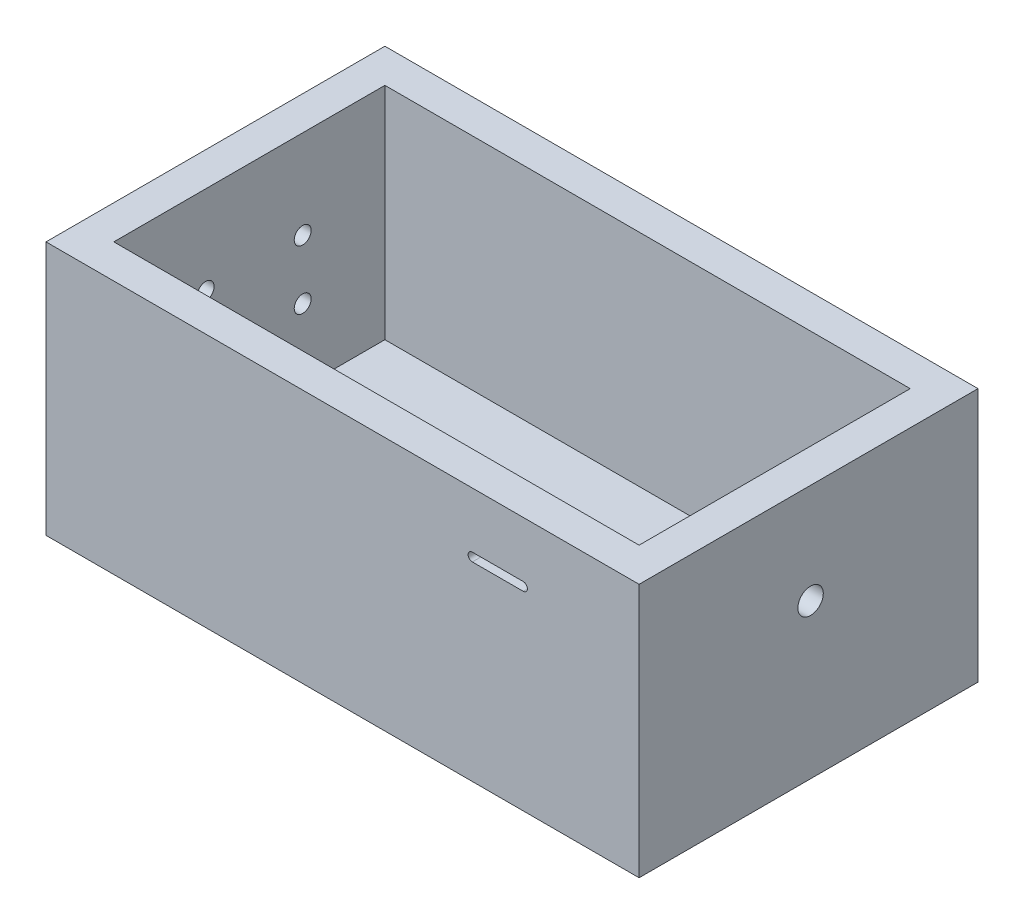
ISO-10303-21;
HEADER;
FILE_DESCRIPTION(('STEP AP214'),'2;1');
FILE_NAME('part.step','',(''),(''),'','','');
FILE_SCHEMA(('AUTOMOTIVE_DESIGN { 1 0 10303 214 1 1 1 1 }'));
ENDSEC;
DATA;
#1=APPLICATION_CONTEXT('core data for automotive mechanical design processes');
#2=APPLICATION_PROTOCOL_DEFINITION('international standard','automotive_design',2000,#1);
#3=PRODUCT_CONTEXT('',#1,'mechanical');
#4=PRODUCT('Part','Part','',(#3));
#5=PRODUCT_RELATED_PRODUCT_CATEGORY('part','',(#4));
#6=PRODUCT_DEFINITION_FORMATION('','',#4);
#7=PRODUCT_DEFINITION_CONTEXT('part definition',#1,'design');
#8=PRODUCT_DEFINITION('design','',#6,#7);
#9=PRODUCT_DEFINITION_SHAPE('','',#8);
#10=(LENGTH_UNIT() NAMED_UNIT(*) SI_UNIT(.MILLI.,.METRE.));
#11=(NAMED_UNIT(*) PLANE_ANGLE_UNIT() SI_UNIT($,.RADIAN.));
#12=(NAMED_UNIT(*) SI_UNIT($,.STERADIAN.) SOLID_ANGLE_UNIT());
#13=UNCERTAINTY_MEASURE_WITH_UNIT(LENGTH_MEASURE(1.E-05),#10,'distance_accuracy_value','');
#14=(GEOMETRIC_REPRESENTATION_CONTEXT(3) GLOBAL_UNCERTAINTY_ASSIGNED_CONTEXT((#13)) GLOBAL_UNIT_ASSIGNED_CONTEXT((#10,
#11,#12)) REPRESENTATION_CONTEXT('',''));
#15=CARTESIAN_POINT('',(0.,0.,0.));
#16=DIRECTION('',(0.,0.,1.));
#17=DIRECTION('',(1.,0.,0.));
#18=AXIS2_PLACEMENT_3D('',#15,#16,#17);
#19=CARTESIAN_POINT('',(-9.23366148550081,150.,-13.4811457688311));
#20=DIRECTION('',(1.,0.,0.));
#21=DIRECTION('',(0.,0.,-1.));
#22=AXIS2_PLACEMENT_3D('',#19,#20,#21);
#23=PLANE('',#22);
#24=CARTESIAN_POINT('',(-9.23366148550079,62.6903456524167,112.31426325689));
#25=DIRECTION('',(-1.,0.,0.));
#26=DIRECTION('',(0.,0.,1.));
#27=AXIS2_PLACEMENT_3D('',#24,#25,#26);
#28=CIRCLE('',#27,5.00000000000001);
#29=CARTESIAN_POINT('',(-9.23366148550079,62.6903456524167,117.31426325689));
#30=VERTEX_POINT('',#29);
#31=EDGE_CURVE('E165',#30,#30,#28,.T.);
#32=ORIENTED_EDGE('',*,*,#31,.F.);
#33=EDGE_LOOP('',(#32));
#34=FACE_BOUND('',#33,.T.);
#35=CARTESIAN_POINT('',(-9.2336614855008,62.6903456524167,55.0397110133396));
#36=DIRECTION('',(-1.,0.,0.));
#37=DIRECTION('',(0.,0.,1.));
#38=AXIS2_PLACEMENT_3D('',#35,#36,#37);
#39=CIRCLE('',#38,5.);
#40=CARTESIAN_POINT('',(-9.2336614855008,62.6903456524167,60.0397110133396));
#41=VERTEX_POINT('',#40);
#42=EDGE_CURVE('E171',#41,#41,#39,.T.);
#43=ORIENTED_EDGE('',*,*,#42,.F.);
#44=EDGE_LOOP('',(#43));
#45=FACE_BOUND('',#44,.T.);
#46=CARTESIAN_POINT('',(-9.23366148550079,97.6671714500048,112.31426325689));
#47=DIRECTION('',(-1.,0.,0.));
#48=DIRECTION('',(0.,0.,1.));
#49=AXIS2_PLACEMENT_3D('',#46,#47,#48);
#50=CIRCLE('',#49,5.00000000000001);
#51=CARTESIAN_POINT('',(-9.23366148550079,97.6671714500048,117.31426325689));
#52=VERTEX_POINT('',#51);
#53=EDGE_CURVE('E177',#52,#52,#50,.T.);
#54=ORIENTED_EDGE('',*,*,#53,.F.);
#55=EDGE_LOOP('',(#54));
#56=FACE_BOUND('',#55,.T.);
#57=CARTESIAN_POINT('',(-9.2336614855008,97.6671714500048,55.0397110133396));
#58=DIRECTION('',(-1.,0.,0.));
#59=DIRECTION('',(0.,0.,1.));
#60=AXIS2_PLACEMENT_3D('',#57,#58,#59);
#61=CIRCLE('',#60,5.);
#62=CARTESIAN_POINT('',(-9.2336614855008,97.6671714500048,60.0397110133396));
#63=VERTEX_POINT('',#62);
#64=EDGE_CURVE('E183',#63,#63,#61,.T.);
#65=ORIENTED_EDGE('',*,*,#64,.F.);
#66=EDGE_LOOP('',(#65));
#67=FACE_BOUND('',#66,.T.);
#68=DIRECTION('',(0.,0.,1.));
#69=VECTOR('',#68,1.);
#70=CARTESIAN_POINT('',(-9.23366148550081,0.,-13.4811457688311));
#71=LINE('',#70,#69);
#72=CARTESIAN_POINT('',(-9.23366148550081,0.,-13.4811457688311));
#73=VERTEX_POINT('',#72);
#74=CARTESIAN_POINT('',(-9.23366148550079,0.,186.518854231169));
#75=VERTEX_POINT('',#74);
#76=EDGE_CURVE('E193',#73,#75,#71,.T.);
#77=ORIENTED_EDGE('',*,*,#76,.T.);
#78=DIRECTION('',(0.,-1.,0.));
#79=VECTOR('',#78,1.);
#80=CARTESIAN_POINT('',(-9.23366148550079,150.,186.518854231169));
#81=LINE('',#80,#79);
#82=CARTESIAN_POINT('',(-9.23366148550079,150.,186.518854231169));
#83=VERTEX_POINT('',#82);
#84=EDGE_CURVE('E11',#83,#75,#81,.T.);
#85=ORIENTED_EDGE('',*,*,#84,.F.);
#86=DIRECTION('',(0.,0.,1.));
#87=VECTOR('',#86,1.);
#88=CARTESIAN_POINT('',(-9.23366148550081,150.,-13.4811457688311));
#89=LINE('',#88,#87);
#90=CARTESIAN_POINT('',(-9.23366148550081,150.,-13.4811457688311));
#91=VERTEX_POINT('',#90);
#92=EDGE_CURVE('E218',#91,#83,#89,.T.);
#93=ORIENTED_EDGE('',*,*,#92,.F.);
#94=DIRECTION('',(0.,-1.,0.));
#95=VECTOR('',#94,1.);
#96=CARTESIAN_POINT('',(-9.23366148550081,150.,-13.4811457688311));
#97=LINE('',#96,#95);
#98=EDGE_CURVE('E230',#91,#73,#97,.T.);
#99=ORIENTED_EDGE('',*,*,#98,.T.);
#100=EDGE_LOOP('',(#77,#85,#93,#99));
#101=FACE_BOUND('',#100,.T.);
#102=ADVANCED_FACE('F32',(#34,#45,#56,#67,#101),#23,.F.);
#103=CARTESIAN_POINT('',(-9.23366148550079,150.,186.518854231169));
#104=DIRECTION('',(0.,0.,-1.));
#105=DIRECTION('',(-1.,0.,0.));
#106=AXIS2_PLACEMENT_3D('',#103,#104,#105);
#107=PLANE('',#106);
#108=DIRECTION('',(1.,0.,0.));
#109=VECTOR('',#108,1.);
#110=CARTESIAN_POINT('',(242.364675660585,112.233767731334,186.518854231169));
#111=LINE('',#110,#109);
#112=CARTESIAN_POINT('',(242.364675660585,112.233767731334,186.518854231169));
#113=VERTEX_POINT('',#112);
#114=CARTESIAN_POINT('',(272.364675660585,112.233767731334,186.518854231169));
#115=VERTEX_POINT('',#114);
#116=EDGE_CURVE('E143',#113,#115,#111,.T.);
#117=ORIENTED_EDGE('',*,*,#116,.F.);
#118=CARTESIAN_POINT('',(242.364675660585,114.733767731334,186.518854231169));
#119=DIRECTION('',(0.,0.,1.));
#120=DIRECTION('',(1.,0.,0.));
#121=AXIS2_PLACEMENT_3D('',#118,#119,#120);
#122=CIRCLE('',#121,2.5);
#123=CARTESIAN_POINT('',(242.364675660585,117.233767731334,186.518854231169));
#124=VERTEX_POINT('',#123);
#125=EDGE_CURVE('E46',#124,#113,#122,.T.);
#126=ORIENTED_EDGE('',*,*,#125,.F.);
#127=DIRECTION('',(-1.,0.,0.));
#128=VECTOR('',#127,1.);
#129=CARTESIAN_POINT('',(242.364675660585,117.233767731334,186.518854231169));
#130=LINE('',#129,#128);
#131=CARTESIAN_POINT('',(272.364675660585,117.233767731334,186.518854231169));
#132=VERTEX_POINT('',#131);
#133=EDGE_CURVE('E130',#132,#124,#130,.T.);
#134=ORIENTED_EDGE('',*,*,#133,.F.);
#135=CARTESIAN_POINT('',(272.364675660585,114.733767731334,186.518854231169));
#136=DIRECTION('',(0.,0.,1.));
#137=DIRECTION('',(-1.,0.,0.));
#138=AXIS2_PLACEMENT_3D('',#135,#136,#137);
#139=CIRCLE('',#138,2.5);
#140=EDGE_CURVE('E138',#115,#132,#139,.T.);
#141=ORIENTED_EDGE('',*,*,#140,.F.);
#142=EDGE_LOOP('',(#117,#126,#134,#141));
#143=FACE_BOUND('',#142,.T.);
#144=DIRECTION('',(1.,0.,0.));
#145=VECTOR('',#144,1.);
#146=CARTESIAN_POINT('',(-9.23366148550079,0.,186.518854231169));
#147=LINE('',#146,#145);
#148=CARTESIAN_POINT('',(340.766338514499,0.,186.518854231169));
#149=VERTEX_POINT('',#148);
#150=EDGE_CURVE('E233',#75,#149,#147,.T.);
#151=ORIENTED_EDGE('',*,*,#150,.T.);
#152=DIRECTION('',(0.,-1.,0.));
#153=VECTOR('',#152,1.);
#154=CARTESIAN_POINT('',(340.766338514499,150.,186.518854231169));
#155=LINE('',#154,#153);
#156=CARTESIAN_POINT('',(340.766338514499,150.,186.518854231169));
#157=VERTEX_POINT('',#156);
#158=EDGE_CURVE('E39',#157,#149,#155,.T.);
#159=ORIENTED_EDGE('',*,*,#158,.F.);
#160=DIRECTION('',(1.,0.,0.));
#161=VECTOR('',#160,1.);
#162=CARTESIAN_POINT('',(-9.23366148550079,150.,186.518854231169));
#163=LINE('',#162,#161);
#164=EDGE_CURVE('E221',#83,#157,#163,.T.);
#165=ORIENTED_EDGE('',*,*,#164,.F.);
#166=ORIENTED_EDGE('',*,*,#84,.T.);
#167=EDGE_LOOP('',(#151,#159,#165,#166));
#168=FACE_BOUND('',#167,.T.);
#169=ADVANCED_FACE('F141',(#143,#168),#107,.F.);
#170=CARTESIAN_POINT('',(340.766338514499,150.,-13.4811457688311));
#171=DIRECTION('',(1.,0.,0.));
#172=DIRECTION('',(0.,0.,-1.));
#173=AXIS2_PLACEMENT_3D('',#170,#171,#172);
#174=PLANE('',#173);
#175=CARTESIAN_POINT('',(340.766338514499,90.9815779253502,85.3188513873166));
#176=DIRECTION('',(1.,0.,0.));
#177=DIRECTION('',(0.,0.,-1.));
#178=AXIS2_PLACEMENT_3D('',#175,#176,#177);
#179=CIRCLE('',#178,7.50000000000001);
#180=CARTESIAN_POINT('',(340.766338514499,90.9815779253502,77.8188513873165));
#181=VERTEX_POINT('',#180);
#182=EDGE_CURVE('E137',#181,#181,#179,.T.);
#183=ORIENTED_EDGE('',*,*,#182,.F.);
#184=EDGE_LOOP('',(#183));
#185=FACE_BOUND('',#184,.T.);
#186=DIRECTION('',(0.,0.,1.));
#187=VECTOR('',#186,1.);
#188=CARTESIAN_POINT('',(340.766338514499,0.,-13.4811457688311));
#189=LINE('',#188,#187);
#190=CARTESIAN_POINT('',(340.766338514499,0.,-13.4811457688311));
#191=VERTEX_POINT('',#190);
#192=EDGE_CURVE('E236',#191,#149,#189,.T.);
#193=ORIENTED_EDGE('',*,*,#192,.F.);
#194=DIRECTION('',(0.,-1.,0.));
#195=VECTOR('',#194,1.);
#196=CARTESIAN_POINT('',(340.766338514499,150.,-13.4811457688311));
#197=LINE('',#196,#195);
#198=CARTESIAN_POINT('',(340.766338514499,150.,-13.4811457688311));
#199=VERTEX_POINT('',#198);
#200=EDGE_CURVE('E242',#199,#191,#197,.T.);
#201=ORIENTED_EDGE('',*,*,#200,.F.);
#202=DIRECTION('',(0.,0.,1.));
#203=VECTOR('',#202,1.);
#204=CARTESIAN_POINT('',(340.766338514499,150.,-13.4811457688311));
#205=LINE('',#204,#203);
#206=EDGE_CURVE('E224',#199,#157,#205,.T.);
#207=ORIENTED_EDGE('',*,*,#206,.T.);
#208=ORIENTED_EDGE('',*,*,#158,.T.);
#209=EDGE_LOOP('',(#193,#201,#207,#208));
#210=FACE_BOUND('',#209,.T.);
#211=ADVANCED_FACE('F246',(#185,#210),#174,.T.);
#212=CARTESIAN_POINT('',(-9.23366148550081,150.,-13.4811457688311));
#213=DIRECTION('',(0.,0.,-1.));
#214=DIRECTION('',(-1.,0.,0.));
#215=AXIS2_PLACEMENT_3D('',#212,#213,#214);
#216=PLANE('',#215);
#217=DIRECTION('',(1.,0.,0.));
#218=VECTOR('',#217,1.);
#219=CARTESIAN_POINT('',(-9.23366148550081,0.,-13.4811457688311));
#220=LINE('',#219,#218);
#221=EDGE_CURVE('E222',#73,#191,#220,.T.);
#222=ORIENTED_EDGE('',*,*,#221,.F.);
#223=ORIENTED_EDGE('',*,*,#98,.F.);
#224=DIRECTION('',(1.,0.,0.));
#225=VECTOR('',#224,1.);
#226=CARTESIAN_POINT('',(-9.23366148550081,150.,-13.4811457688311));
#227=LINE('',#226,#225);
#228=EDGE_CURVE('E227',#91,#199,#227,.T.);
#229=ORIENTED_EDGE('',*,*,#228,.T.);
#230=ORIENTED_EDGE('',*,*,#200,.T.);
#231=EDGE_LOOP('',(#222,#223,#229,#230));
#232=FACE_BOUND('',#231,.T.);
#233=ADVANCED_FACE('F254',(#232),#216,.T.);
#234=CARTESIAN_POINT('',(0.,150.,0.));
#235=DIRECTION('',(0.,1.,0.));
#236=DIRECTION('',(0.,0.,1.));
#237=AXIS2_PLACEMENT_3D('',#234,#235,#236);
#238=PLANE('',#237);
#239=DIRECTION('',(0.,0.,1.));
#240=VECTOR('',#239,1.);
#241=CARTESIAN_POINT('',(10.7663385144992,150.,-13.4811457688311));
#242=LINE('',#241,#240);
#243=CARTESIAN_POINT('',(10.7663385144992,150.,6.51885423116886));
#244=VERTEX_POINT('',#243);
#245=CARTESIAN_POINT('',(10.7663385144992,150.,166.518854231169));
#246=VERTEX_POINT('',#245);
#247=EDGE_CURVE('E209',#244,#246,#242,.T.);
#248=ORIENTED_EDGE('',*,*,#247,.F.);
#249=DIRECTION('',(1.,0.,0.));
#250=VECTOR('',#249,1.);
#251=CARTESIAN_POINT('',(-9.23366148550081,150.,6.51885423116886));
#252=LINE('',#251,#250);
#253=CARTESIAN_POINT('',(320.766338514499,150.,6.51885423116886));
#254=VERTEX_POINT('',#253);
#255=EDGE_CURVE('E198',#244,#254,#252,.T.);
#256=ORIENTED_EDGE('',*,*,#255,.T.);
#257=DIRECTION('',(0.,0.,1.));
#258=VECTOR('',#257,1.);
#259=CARTESIAN_POINT('',(320.766338514499,150.,-13.4811457688311));
#260=LINE('',#259,#258);
#261=CARTESIAN_POINT('',(320.766338514499,150.,166.518854231169));
#262=VERTEX_POINT('',#261);
#263=EDGE_CURVE('E213',#254,#262,#260,.T.);
#264=ORIENTED_EDGE('',*,*,#263,.T.);
#265=DIRECTION('',(1.,0.,0.));
#266=VECTOR('',#265,1.);
#267=CARTESIAN_POINT('',(-9.23366148550079,150.,166.518854231169));
#268=LINE('',#267,#266);
#269=EDGE_CURVE('E211',#246,#262,#268,.T.);
#270=ORIENTED_EDGE('',*,*,#269,.F.);
#271=EDGE_LOOP('',(#248,#256,#264,#270));
#272=FACE_BOUND('',#271,.T.);
#273=ORIENTED_EDGE('',*,*,#92,.T.);
#274=ORIENTED_EDGE('',*,*,#164,.T.);
#275=ORIENTED_EDGE('',*,*,#206,.F.);
#276=ORIENTED_EDGE('',*,*,#228,.F.);
#277=EDGE_LOOP('',(#273,#274,#275,#276));
#278=FACE_BOUND('',#277,.T.);
#279=ADVANCED_FACE('F258',(#272,#278),#238,.T.);
#280=CARTESIAN_POINT('',(0.,0.,0.));
#281=DIRECTION('',(0.,1.,0.));
#282=DIRECTION('',(0.,0.,1.));
#283=AXIS2_PLACEMENT_3D('',#280,#281,#282);
#284=PLANE('',#283);
#285=ORIENTED_EDGE('',*,*,#76,.F.);
#286=ORIENTED_EDGE('',*,*,#221,.T.);
#287=ORIENTED_EDGE('',*,*,#192,.T.);
#288=ORIENTED_EDGE('',*,*,#150,.F.);
#289=EDGE_LOOP('',(#285,#286,#287,#288));
#290=FACE_BOUND('',#289,.T.);
#291=ADVANCED_FACE('F251',(#290),#284,.F.);
#292=CARTESIAN_POINT('',(10.7663385144992,150.,-13.4811457688311));
#293=DIRECTION('',(1.,0.,0.));
#294=DIRECTION('',(0.,0.,-1.));
#295=AXIS2_PLACEMENT_3D('',#292,#293,#294);
#296=PLANE('',#295);
#297=CARTESIAN_POINT('',(10.7663385144992,62.6903456524167,112.31426325689));
#298=DIRECTION('',(1.,0.,0.));
#299=DIRECTION('',(0.,0.,-1.));
#300=AXIS2_PLACEMENT_3D('',#297,#298,#299);
#301=CIRCLE('',#300,5.00000000000001);
#302=CARTESIAN_POINT('',(10.7663385144992,62.6903456524167,107.31426325689));
#303=VERTEX_POINT('',#302);
#304=EDGE_CURVE('E162',#303,#303,#301,.F.);
#305=ORIENTED_EDGE('',*,*,#304,.T.);
#306=EDGE_LOOP('',(#305));
#307=FACE_BOUND('',#306,.T.);
#308=CARTESIAN_POINT('',(10.7663385144992,62.6903456524167,55.0397110133396));
#309=DIRECTION('',(1.,0.,0.));
#310=DIRECTION('',(0.,0.,-1.));
#311=AXIS2_PLACEMENT_3D('',#308,#309,#310);
#312=CIRCLE('',#311,5.);
#313=CARTESIAN_POINT('',(10.7663385144992,62.6903456524167,50.0397110133396));
#314=VERTEX_POINT('',#313);
#315=EDGE_CURVE('E168',#314,#314,#312,.F.);
#316=ORIENTED_EDGE('',*,*,#315,.T.);
#317=EDGE_LOOP('',(#316));
#318=FACE_BOUND('',#317,.T.);
#319=CARTESIAN_POINT('',(10.7663385144992,97.6671714500048,112.31426325689));
#320=DIRECTION('',(1.,0.,0.));
#321=DIRECTION('',(0.,0.,-1.));
#322=AXIS2_PLACEMENT_3D('',#319,#320,#321);
#323=CIRCLE('',#322,5.00000000000001);
#324=CARTESIAN_POINT('',(10.7663385144992,97.6671714500048,107.31426325689));
#325=VERTEX_POINT('',#324);
#326=EDGE_CURVE('E174',#325,#325,#323,.F.);
#327=ORIENTED_EDGE('',*,*,#326,.T.);
#328=EDGE_LOOP('',(#327));
#329=FACE_BOUND('',#328,.T.);
#330=CARTESIAN_POINT('',(10.7663385144992,97.6671714500048,55.0397110133396));
#331=DIRECTION('',(1.,0.,0.));
#332=DIRECTION('',(0.,0.,-1.));
#333=AXIS2_PLACEMENT_3D('',#330,#331,#332);
#334=CIRCLE('',#333,5.);
#335=CARTESIAN_POINT('',(10.7663385144992,97.6671714500048,50.0397110133396));
#336=VERTEX_POINT('',#335);
#337=EDGE_CURVE('E180',#336,#336,#334,.F.);
#338=ORIENTED_EDGE('',*,*,#337,.T.);
#339=EDGE_LOOP('',(#338));
#340=FACE_BOUND('',#339,.T.);
#341=DIRECTION('',(0.,0.,1.));
#342=VECTOR('',#341,1.);
#343=CARTESIAN_POINT('',(10.7663385144992,20.,-13.4811457688311));
#344=LINE('',#343,#342);
#345=CARTESIAN_POINT('',(10.7663385144992,20.,6.51885423116886));
#346=VERTEX_POINT('',#345);
#347=CARTESIAN_POINT('',(10.7663385144992,20.,166.518854231169));
#348=VERTEX_POINT('',#347);
#349=EDGE_CURVE('E186',#346,#348,#344,.T.);
#350=ORIENTED_EDGE('',*,*,#349,.F.);
#351=DIRECTION('',(0.,-1.,0.));
#352=VECTOR('',#351,1.);
#353=CARTESIAN_POINT('',(10.7663385144992,150.,6.51885423116886));
#354=LINE('',#353,#352);
#355=EDGE_CURVE('E195',#244,#346,#354,.T.);
#356=ORIENTED_EDGE('',*,*,#355,.F.);
#357=ORIENTED_EDGE('',*,*,#247,.T.);
#358=DIRECTION('',(0.,-1.,0.));
#359=VECTOR('',#358,1.);
#360=CARTESIAN_POINT('',(10.7663385144992,150.,166.518854231169));
#361=LINE('',#360,#359);
#362=EDGE_CURVE('E190',#246,#348,#361,.T.);
#363=ORIENTED_EDGE('',*,*,#362,.T.);
#364=EDGE_LOOP('',(#350,#356,#357,#363));
#365=FACE_BOUND('',#364,.T.);
#366=ADVANCED_FACE('F292',(#307,#318,#329,#340,#365),#296,.T.);
#367=CARTESIAN_POINT('',(-9.23366148550079,150.,166.518854231169));
#368=DIRECTION('',(0.,0.,-1.));
#369=DIRECTION('',(-1.,0.,0.));
#370=AXIS2_PLACEMENT_3D('',#367,#368,#369);
#371=PLANE('',#370);
#372=CARTESIAN_POINT('',(242.364675660585,114.733767731334,166.518854231169));
#373=DIRECTION('',(0.,0.,-1.));
#374=DIRECTION('',(-1.,0.,0.));
#375=AXIS2_PLACEMENT_3D('',#372,#373,#374);
#376=CIRCLE('',#375,2.5);
#377=CARTESIAN_POINT('',(242.364675660585,117.233767731334,166.518854231169));
#378=VERTEX_POINT('',#377);
#379=CARTESIAN_POINT('',(242.364675660585,112.233767731334,166.518854231169));
#380=VERTEX_POINT('',#379);
#381=EDGE_CURVE('E123',#378,#380,#376,.F.);
#382=ORIENTED_EDGE('',*,*,#381,.T.);
#383=DIRECTION('',(1.,0.,0.));
#384=VECTOR('',#383,1.);
#385=CARTESIAN_POINT('',(242.364675660585,112.233767731334,166.518854231169));
#386=LINE('',#385,#384);
#387=CARTESIAN_POINT('',(272.364675660585,112.233767731334,166.518854231169));
#388=VERTEX_POINT('',#387);
#389=EDGE_CURVE('E146',#380,#388,#386,.T.);
#390=ORIENTED_EDGE('',*,*,#389,.T.);
#391=CARTESIAN_POINT('',(272.364675660585,114.733767731334,166.518854231169));
#392=DIRECTION('',(0.,0.,-1.));
#393=DIRECTION('',(-1.,0.,0.));
#394=AXIS2_PLACEMENT_3D('',#391,#392,#393);
#395=CIRCLE('',#394,2.5);
#396=CARTESIAN_POINT('',(272.364675660585,117.233767731334,166.518854231169));
#397=VERTEX_POINT('',#396);
#398=EDGE_CURVE('E126',#388,#397,#395,.F.);
#399=ORIENTED_EDGE('',*,*,#398,.T.);
#400=DIRECTION('',(-1.,0.,0.));
#401=VECTOR('',#400,1.);
#402=CARTESIAN_POINT('',(242.364675660585,117.233767731334,166.518854231169));
#403=LINE('',#402,#401);
#404=EDGE_CURVE('E127',#397,#378,#403,.T.);
#405=ORIENTED_EDGE('',*,*,#404,.T.);
#406=EDGE_LOOP('',(#382,#390,#399,#405));
#407=FACE_BOUND('',#406,.T.);
#408=DIRECTION('',(1.,0.,0.));
#409=VECTOR('',#408,1.);
#410=CARTESIAN_POINT('',(-9.23366148550079,20.,166.518854231169));
#411=LINE('',#410,#409);
#412=CARTESIAN_POINT('',(320.766338514499,20.,166.518854231169));
#413=VERTEX_POINT('',#412);
#414=EDGE_CURVE('E189',#348,#413,#411,.T.);
#415=ORIENTED_EDGE('',*,*,#414,.F.);
#416=ORIENTED_EDGE('',*,*,#362,.F.);
#417=ORIENTED_EDGE('',*,*,#269,.T.);
#418=DIRECTION('',(0.,-1.,0.));
#419=VECTOR('',#418,1.);
#420=CARTESIAN_POINT('',(320.766338514499,150.,166.518854231169));
#421=LINE('',#420,#419);
#422=EDGE_CURVE('E194',#262,#413,#421,.T.);
#423=ORIENTED_EDGE('',*,*,#422,.T.);
#424=EDGE_LOOP('',(#415,#416,#417,#423));
#425=FACE_BOUND('',#424,.T.);
#426=ADVANCED_FACE('F295',(#407,#425),#371,.T.);
#427=CARTESIAN_POINT('',(320.766338514499,150.,-13.4811457688311));
#428=DIRECTION('',(1.,0.,0.));
#429=DIRECTION('',(0.,0.,-1.));
#430=AXIS2_PLACEMENT_3D('',#427,#428,#429);
#431=PLANE('',#430);
#432=CARTESIAN_POINT('',(320.766338514499,90.9815779253502,85.3188513873166));
#433=DIRECTION('',(1.,0.,0.));
#434=DIRECTION('',(0.,0.,-1.));
#435=AXIS2_PLACEMENT_3D('',#432,#433,#434);
#436=CIRCLE('',#435,7.50000000000001);
#437=CARTESIAN_POINT('',(320.766338514499,90.9815779253502,77.8188513873165));
#438=VERTEX_POINT('',#437);
#439=EDGE_CURVE('E159',#438,#438,#436,.F.);
#440=ORIENTED_EDGE('',*,*,#439,.F.);
#441=EDGE_LOOP('',(#440));
#442=FACE_BOUND('',#441,.T.);
#443=DIRECTION('',(0.,0.,1.));
#444=VECTOR('',#443,1.);
#445=CARTESIAN_POINT('',(320.766338514499,20.,-13.4811457688311));
#446=LINE('',#445,#444);
#447=CARTESIAN_POINT('',(320.766338514499,20.,6.51885423116886));
#448=VERTEX_POINT('',#447);
#449=EDGE_CURVE('E201',#448,#413,#446,.T.);
#450=ORIENTED_EDGE('',*,*,#449,.T.);
#451=ORIENTED_EDGE('',*,*,#422,.F.);
#452=ORIENTED_EDGE('',*,*,#263,.F.);
#453=DIRECTION('',(0.,-1.,0.));
#454=VECTOR('',#453,1.);
#455=CARTESIAN_POINT('',(320.766338514499,150.,6.51885423116886));
#456=LINE('',#455,#454);
#457=EDGE_CURVE('E197',#254,#448,#456,.T.);
#458=ORIENTED_EDGE('',*,*,#457,.T.);
#459=EDGE_LOOP('',(#450,#451,#452,#458));
#460=FACE_BOUND('',#459,.T.);
#461=ADVANCED_FACE('F299',(#442,#460),#431,.F.);
#462=CARTESIAN_POINT('',(-9.23366148550081,150.,6.51885423116886));
#463=DIRECTION('',(0.,0.,-1.));
#464=DIRECTION('',(-1.,0.,0.));
#465=AXIS2_PLACEMENT_3D('',#462,#463,#464);
#466=PLANE('',#465);
#467=DIRECTION('',(1.,0.,0.));
#468=VECTOR('',#467,1.);
#469=CARTESIAN_POINT('',(-9.23366148550081,20.,6.51885423116886));
#470=LINE('',#469,#468);
#471=EDGE_CURVE('E205',#346,#448,#470,.T.);
#472=ORIENTED_EDGE('',*,*,#471,.T.);
#473=ORIENTED_EDGE('',*,*,#457,.F.);
#474=ORIENTED_EDGE('',*,*,#255,.F.);
#475=ORIENTED_EDGE('',*,*,#355,.T.);
#476=EDGE_LOOP('',(#472,#473,#474,#475));
#477=FACE_BOUND('',#476,.T.);
#478=ADVANCED_FACE('F286',(#477),#466,.F.);
#479=CARTESIAN_POINT('',(0.,20.,0.));
#480=DIRECTION('',(0.,1.,0.));
#481=DIRECTION('',(0.,0.,1.));
#482=AXIS2_PLACEMENT_3D('',#479,#480,#481);
#483=PLANE('',#482);
#484=ORIENTED_EDGE('',*,*,#349,.T.);
#485=ORIENTED_EDGE('',*,*,#414,.T.);
#486=ORIENTED_EDGE('',*,*,#449,.F.);
#487=ORIENTED_EDGE('',*,*,#471,.F.);
#488=EDGE_LOOP('',(#484,#485,#486,#487));
#489=FACE_BOUND('',#488,.T.);
#490=ADVANCED_FACE('F276',(#489),#483,.T.);
#491=CARTESIAN_POINT('',(340.767338514499,97.6671714500048,55.0397110133396));
#492=DIRECTION('',(-1.,0.,0.));
#493=DIRECTION('',(0.,0.,1.));
#494=AXIS2_PLACEMENT_3D('',#491,#492,#493);
#495=CYLINDRICAL_SURFACE('',#494,5.);
#496=ORIENTED_EDGE('',*,*,#337,.F.);
#497=EDGE_LOOP('',(#496));
#498=FACE_BOUND('',#497,.T.);
#499=ORIENTED_EDGE('',*,*,#64,.T.);
#500=EDGE_LOOP('',(#499));
#501=FACE_BOUND('',#500,.T.);
#502=ADVANCED_FACE('F273',(#498,#501),#495,.F.);
#503=CARTESIAN_POINT('',(340.767338514499,97.6671714500048,112.31426325689));
#504=DIRECTION('',(-1.,0.,0.));
#505=DIRECTION('',(0.,0.,1.));
#506=AXIS2_PLACEMENT_3D('',#503,#504,#505);
#507=CYLINDRICAL_SURFACE('',#506,5.00000000000001);
#508=ORIENTED_EDGE('',*,*,#326,.F.);
#509=EDGE_LOOP('',(#508));
#510=FACE_BOUND('',#509,.T.);
#511=ORIENTED_EDGE('',*,*,#53,.T.);
#512=EDGE_LOOP('',(#511));
#513=FACE_BOUND('',#512,.T.);
#514=ADVANCED_FACE('F275',(#510,#513),#507,.F.);
#515=CARTESIAN_POINT('',(340.767338514499,62.6903456524167,55.0397110133396));
#516=DIRECTION('',(-1.,0.,0.));
#517=DIRECTION('',(0.,0.,1.));
#518=AXIS2_PLACEMENT_3D('',#515,#516,#517);
#519=CYLINDRICAL_SURFACE('',#518,5.);
#520=ORIENTED_EDGE('',*,*,#315,.F.);
#521=EDGE_LOOP('',(#520));
#522=FACE_BOUND('',#521,.T.);
#523=ORIENTED_EDGE('',*,*,#42,.T.);
#524=EDGE_LOOP('',(#523));
#525=FACE_BOUND('',#524,.T.);
#526=ADVANCED_FACE('F283',(#522,#525),#519,.F.);
#527=CARTESIAN_POINT('',(340.767338514499,62.6903456524167,112.31426325689));
#528=DIRECTION('',(-1.,0.,0.));
#529=DIRECTION('',(0.,0.,1.));
#530=AXIS2_PLACEMENT_3D('',#527,#528,#529);
#531=CYLINDRICAL_SURFACE('',#530,5.00000000000001);
#532=ORIENTED_EDGE('',*,*,#304,.F.);
#533=EDGE_LOOP('',(#532));
#534=FACE_BOUND('',#533,.T.);
#535=ORIENTED_EDGE('',*,*,#31,.T.);
#536=EDGE_LOOP('',(#535));
#537=FACE_BOUND('',#536,.T.);
#538=ADVANCED_FACE('F323',(#534,#537),#531,.F.);
#539=CARTESIAN_POINT('',(-9.23466148550084,90.9815779253502,85.3188513873167));
#540=DIRECTION('',(1.,0.,0.));
#541=DIRECTION('',(0.,0.,-1.));
#542=AXIS2_PLACEMENT_3D('',#539,#540,#541);
#543=CYLINDRICAL_SURFACE('',#542,7.50000000000001);
#544=ORIENTED_EDGE('',*,*,#182,.T.);
#545=EDGE_LOOP('',(#544));
#546=FACE_BOUND('',#545,.T.);
#547=ORIENTED_EDGE('',*,*,#439,.T.);
#548=EDGE_LOOP('',(#547));
#549=FACE_BOUND('',#548,.T.);
#550=ADVANCED_FACE('F320',(#546,#549),#543,.F.);
#551=CARTESIAN_POINT('',(242.364675660585,114.733767731334,-13.4821457688311));
#552=DIRECTION('',(0.,0.,1.));
#553=DIRECTION('',(1.,0.,0.));
#554=AXIS2_PLACEMENT_3D('',#551,#552,#553);
#555=CYLINDRICAL_SURFACE('',#554,2.5);
#556=DIRECTION('',(0.,0.,1.));
#557=VECTOR('',#556,1.);
#558=CARTESIAN_POINT('',(242.364675660585,117.233767731334,-13.4821457688311));
#559=LINE('',#558,#557);
#560=EDGE_CURVE('E119',#378,#124,#559,.T.);
#561=ORIENTED_EDGE('',*,*,#560,.T.);
#562=ORIENTED_EDGE('',*,*,#125,.T.);
#563=DIRECTION('',(0.,0.,1.));
#564=VECTOR('',#563,1.);
#565=CARTESIAN_POINT('',(242.364675660585,112.233767731334,-13.4821457688311));
#566=LINE('',#565,#564);
#567=EDGE_CURVE('E151',#380,#113,#566,.T.);
#568=ORIENTED_EDGE('',*,*,#567,.F.);
#569=ORIENTED_EDGE('',*,*,#381,.F.);
#570=EDGE_LOOP('',(#561,#562,#568,#569));
#571=FACE_BOUND('',#570,.T.);
#572=ADVANCED_FACE('F121',(#571),#555,.F.);
#573=CARTESIAN_POINT('',(242.364675660585,117.233767731334,-13.4821457688311));
#574=DIRECTION('',(0.,1.,0.));
#575=DIRECTION('',(0.,0.,1.));
#576=AXIS2_PLACEMENT_3D('',#573,#574,#575);
#577=PLANE('',#576);
#578=DIRECTION('',(0.,0.,1.));
#579=VECTOR('',#578,1.);
#580=CARTESIAN_POINT('',(272.364675660585,117.233767731334,-13.4821457688311));
#581=LINE('',#580,#579);
#582=EDGE_CURVE('E133',#397,#132,#581,.T.);
#583=ORIENTED_EDGE('',*,*,#582,.T.);
#584=ORIENTED_EDGE('',*,*,#133,.T.);
#585=ORIENTED_EDGE('',*,*,#560,.F.);
#586=ORIENTED_EDGE('',*,*,#404,.F.);
#587=EDGE_LOOP('',(#583,#584,#585,#586));
#588=FACE_BOUND('',#587,.T.);
#589=ADVANCED_FACE('F131',(#588),#577,.F.);
#590=CARTESIAN_POINT('',(272.364675660585,114.733767731334,-13.4821457688311));
#591=DIRECTION('',(0.,0.,1.));
#592=DIRECTION('',(1.,0.,0.));
#593=AXIS2_PLACEMENT_3D('',#590,#591,#592);
#594=CYLINDRICAL_SURFACE('',#593,2.5);
#595=DIRECTION('',(0.,0.,1.));
#596=VECTOR('',#595,1.);
#597=CARTESIAN_POINT('',(272.364675660585,112.233767731334,-13.4821457688311));
#598=LINE('',#597,#596);
#599=EDGE_CURVE('E54',#388,#115,#598,.T.);
#600=ORIENTED_EDGE('',*,*,#599,.T.);
#601=ORIENTED_EDGE('',*,*,#140,.T.);
#602=ORIENTED_EDGE('',*,*,#582,.F.);
#603=ORIENTED_EDGE('',*,*,#398,.F.);
#604=EDGE_LOOP('',(#600,#601,#602,#603));
#605=FACE_BOUND('',#604,.T.);
#606=ADVANCED_FACE('F408',(#605),#594,.F.);
#607=CARTESIAN_POINT('',(242.364675660585,112.233767731334,-13.4821457688311));
#608=DIRECTION('',(0.,-1.,0.));
#609=DIRECTION('',(0.,0.,-1.));
#610=AXIS2_PLACEMENT_3D('',#607,#608,#609);
#611=PLANE('',#610);
#612=ORIENTED_EDGE('',*,*,#567,.T.);
#613=ORIENTED_EDGE('',*,*,#116,.T.);
#614=ORIENTED_EDGE('',*,*,#599,.F.);
#615=ORIENTED_EDGE('',*,*,#389,.F.);
#616=EDGE_LOOP('',(#612,#613,#614,#615));
#617=FACE_BOUND('',#616,.T.);
#618=ADVANCED_FACE('F416',(#617),#611,.F.);
#619=CLOSED_SHELL('',(#102,#169,#211,#233,#279,#291,#366,#426,#461,#478,#490,#502,#514,#526,
#538,#550,#572,#589,#606,#618));
#620=MANIFOLD_SOLID_BREP('B2',#619);
#621=ADVANCED_BREP_SHAPE_REPRESENTATION('',(#18,#620),#14);
#622=SHAPE_DEFINITION_REPRESENTATION(#9,#621);
ENDSEC;
END-ISO-10303-21;
